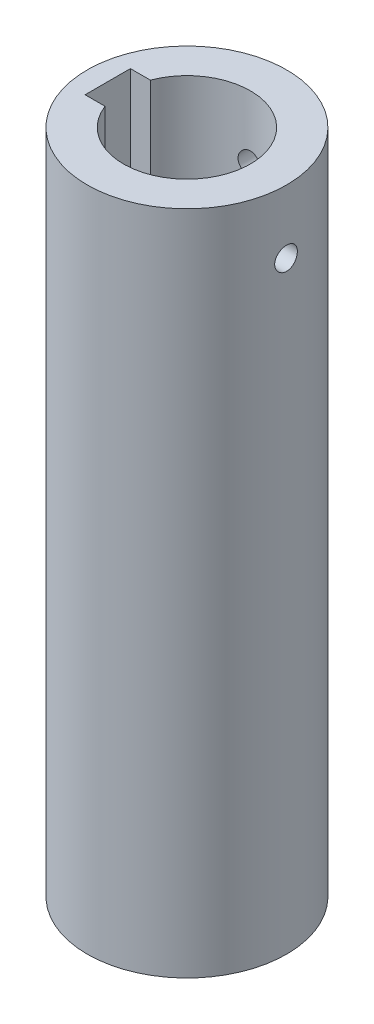
ISO-10303-21;
HEADER;
FILE_DESCRIPTION(('STEP AP214'),'2;1');
FILE_NAME('part.step','',(''),(''),'','','');
FILE_SCHEMA(('AUTOMOTIVE_DESIGN { 1 0 10303 214 1 1 1 1 }'));
ENDSEC;
DATA;
#1=APPLICATION_CONTEXT('core data for automotive mechanical design processes');
#2=APPLICATION_PROTOCOL_DEFINITION('international standard','automotive_design',2000,#1);
#3=PRODUCT_CONTEXT('',#1,'mechanical');
#4=PRODUCT('Part','Part','',(#3));
#5=PRODUCT_RELATED_PRODUCT_CATEGORY('part','',(#4));
#6=PRODUCT_DEFINITION_FORMATION('','',#4);
#7=PRODUCT_DEFINITION_CONTEXT('part definition',#1,'design');
#8=PRODUCT_DEFINITION('design','',#6,#7);
#9=PRODUCT_DEFINITION_SHAPE('','',#8);
#10=(LENGTH_UNIT() NAMED_UNIT(*) SI_UNIT(.MILLI.,.METRE.));
#11=(NAMED_UNIT(*) PLANE_ANGLE_UNIT() SI_UNIT($,.RADIAN.));
#12=(NAMED_UNIT(*) SI_UNIT($,.STERADIAN.) SOLID_ANGLE_UNIT());
#13=UNCERTAINTY_MEASURE_WITH_UNIT(LENGTH_MEASURE(1.E-05),#10,'distance_accuracy_value','');
#14=(GEOMETRIC_REPRESENTATION_CONTEXT(3) GLOBAL_UNCERTAINTY_ASSIGNED_CONTEXT((#13)) GLOBAL_UNIT_ASSIGNED_CONTEXT((#10,
#11,#12)) REPRESENTATION_CONTEXT('',''));
#15=CARTESIAN_POINT('',(0.,0.,0.));
#16=DIRECTION('',(0.,0.,1.));
#17=DIRECTION('',(1.,0.,0.));
#18=AXIS2_PLACEMENT_3D('',#15,#16,#17);
#19=CARTESIAN_POINT('',(0.,36.75,0.));
#20=DIRECTION('',(0.,1.,0.));
#21=DIRECTION('',(0.,0.,1.));
#22=AXIS2_PLACEMENT_3D('',#19,#20,#21);
#23=PLANE('',#22);
#24=CARTESIAN_POINT('',(0.,36.75,0.));
#25=DIRECTION('',(0.,1.,0.));
#26=DIRECTION('',(0.,0.,1.));
#27=AXIS2_PLACEMENT_3D('',#24,#25,#26);
#28=CIRCLE('',#27,11.);
#29=CARTESIAN_POINT('',(0.,36.75,11.));
#30=VERTEX_POINT('',#29);
#31=EDGE_CURVE('E100',#30,#30,#28,.T.);
#32=ORIENTED_EDGE('',*,*,#31,.T.);
#33=EDGE_LOOP('',(#32));
#34=FACE_BOUND('',#33,.T.);
#35=DIRECTION('',(0.,0.,-1.));
#36=VECTOR('',#35,1.);
#37=CARTESIAN_POINT('',(-8.73834841531101,36.75,0.));
#38=LINE('',#37,#36);
#39=CARTESIAN_POINT('',(-8.73834841531101,36.75,2.5));
#40=VERTEX_POINT('',#39);
#41=CARTESIAN_POINT('',(-8.73834841531101,36.75,-2.5));
#42=VERTEX_POINT('',#41);
#43=EDGE_CURVE('E59',#40,#42,#38,.T.);
#44=ORIENTED_EDGE('',*,*,#43,.T.);
#45=DIRECTION('',(1.,0.,0.));
#46=VECTOR('',#45,1.);
#47=CARTESIAN_POINT('',(0.,36.75,-2.5));
#48=LINE('',#47,#46);
#49=CARTESIAN_POINT('',(-6.53834841531101,36.75,-2.5));
#50=VERTEX_POINT('',#49);
#51=EDGE_CURVE('E118',#42,#50,#48,.T.);
#52=ORIENTED_EDGE('',*,*,#51,.T.);
#53=CARTESIAN_POINT('',(0.,36.75,0.));
#54=DIRECTION('',(0.,1.,0.));
#55=DIRECTION('',(0.,0.,1.));
#56=AXIS2_PLACEMENT_3D('',#53,#54,#55);
#57=CIRCLE('',#56,7.);
#58=CARTESIAN_POINT('',(-6.53834841531101,36.75,2.5));
#59=VERTEX_POINT('',#58);
#60=EDGE_CURVE('E178',#59,#50,#57,.T.);
#61=ORIENTED_EDGE('',*,*,#60,.F.);
#62=DIRECTION('',(-1.,0.,0.));
#63=VECTOR('',#62,1.);
#64=CARTESIAN_POINT('',(0.,36.75,2.5));
#65=LINE('',#64,#63);
#66=EDGE_CURVE('E64',#59,#40,#65,.T.);
#67=ORIENTED_EDGE('',*,*,#66,.T.);
#68=EDGE_LOOP('',(#44,#52,#61,#67));
#69=FACE_BOUND('',#68,.T.);
#70=ADVANCED_FACE('F42',(#34,#69),#23,.T.);
#71=CARTESIAN_POINT('',(0.,-36.75,0.));
#72=DIRECTION('',(0.,1.,0.));
#73=DIRECTION('',(0.,0.,1.));
#74=AXIS2_PLACEMENT_3D('',#71,#72,#73);
#75=PLANE('',#74);
#76=CARTESIAN_POINT('',(0.,-36.75,0.));
#77=DIRECTION('',(0.,1.,0.));
#78=DIRECTION('',(0.,0.,1.));
#79=AXIS2_PLACEMENT_3D('',#76,#77,#78);
#80=CIRCLE('',#79,11.);
#81=CARTESIAN_POINT('',(0.,-36.75,11.));
#82=VERTEX_POINT('',#81);
#83=EDGE_CURVE('E175',#82,#82,#80,.T.);
#84=ORIENTED_EDGE('',*,*,#83,.F.);
#85=EDGE_LOOP('',(#84));
#86=FACE_BOUND('',#85,.T.);
#87=DIRECTION('',(1.,0.,0.));
#88=VECTOR('',#87,1.);
#89=CARTESIAN_POINT('',(0.,-36.75,-2.5));
#90=LINE('',#89,#88);
#91=CARTESIAN_POINT('',(-8.73834841531101,-36.75,-2.5));
#92=VERTEX_POINT('',#91);
#93=CARTESIAN_POINT('',(-6.53834841531101,-36.75,-2.5));
#94=VERTEX_POINT('',#93);
#95=EDGE_CURVE('E11',#92,#94,#90,.T.);
#96=ORIENTED_EDGE('',*,*,#95,.F.);
#97=DIRECTION('',(0.,0.,-1.));
#98=VECTOR('',#97,1.);
#99=CARTESIAN_POINT('',(-8.73834841531101,-36.75,0.));
#100=LINE('',#99,#98);
#101=CARTESIAN_POINT('',(-8.73834841531101,-36.75,2.5));
#102=VERTEX_POINT('',#101);
#103=EDGE_CURVE('E52',#102,#92,#100,.T.);
#104=ORIENTED_EDGE('',*,*,#103,.F.);
#105=DIRECTION('',(-1.,0.,0.));
#106=VECTOR('',#105,1.);
#107=CARTESIAN_POINT('',(0.,-36.75,2.5));
#108=LINE('',#107,#106);
#109=CARTESIAN_POINT('',(-6.53834841531101,-36.75,2.5));
#110=VERTEX_POINT('',#109);
#111=EDGE_CURVE('E86',#110,#102,#108,.T.);
#112=ORIENTED_EDGE('',*,*,#111,.F.);
#113=CARTESIAN_POINT('',(0.,-36.75,0.));
#114=DIRECTION('',(0.,1.,0.));
#115=DIRECTION('',(0.,0.,1.));
#116=AXIS2_PLACEMENT_3D('',#113,#114,#115);
#117=CIRCLE('',#116,7.);
#118=EDGE_CURVE('E184',#110,#94,#117,.T.);
#119=ORIENTED_EDGE('',*,*,#118,.T.);
#120=EDGE_LOOP('',(#96,#104,#112,#119));
#121=FACE_BOUND('',#120,.T.);
#122=ADVANCED_FACE('F84',(#86,#121),#75,.F.);
#123=CARTESIAN_POINT('',(0.,36.75,0.));
#124=DIRECTION('',(0.,-1.,0.));
#125=DIRECTION('',(0.,0.,-1.));
#126=AXIS2_PLACEMENT_3D('',#123,#124,#125);
#127=CYLINDRICAL_SURFACE('',#126,11.);
#128=CARTESIAN_POINT('',(10.9287464971972,29.75,-1.24999999999996));
#129=CARTESIAN_POINT('',(10.9287474203412,29.6800305842613,-1.24999699672958));
#130=CARTESIAN_POINT('',(10.9294256968444,29.6100162149609,-1.24410533123416));
#131=CARTESIAN_POINT('',(10.93206480453,29.4719324468276,-1.22069346279131));
#132=CARTESIAN_POINT('',(10.9340270111777,29.4038652156636,-1.20316078861798));
#133=CARTESIAN_POINT('',(10.9390089167987,29.2716951523593,-1.15698736299401));
#134=CARTESIAN_POINT('',(10.9420279348789,29.2075897988341,-1.12835376248756));
#135=CARTESIAN_POINT('',(10.9487824680852,29.0851073826262,-1.06080587174065));
#136=CARTESIAN_POINT('',(10.9525178511687,29.0267292672735,-1.02189347562245));
#137=CARTESIAN_POINT('',(10.960303690773,28.9170740793633,-0.934698474057933));
#138=CARTESIAN_POINT('',(10.9643553896711,28.8658274589927,-0.886377679317052));
#139=CARTESIAN_POINT('',(10.972306118699,28.772152635249,-0.781819512439376));
#140=CARTESIAN_POINT('',(10.9762051415251,28.7297248533291,-0.725581762165833));
#141=CARTESIAN_POINT('',(10.9834237379778,28.6547845265636,-0.606596705986008));
#142=CARTESIAN_POINT('',(10.9867417055687,28.6222992834268,-0.54383209892827));
#143=CARTESIAN_POINT('',(10.9924107489094,28.5683409317162,-0.41369460258411));
#144=CARTESIAN_POINT('',(10.9947618545927,28.5468674822175,-0.346321856038748));
#145=CARTESIAN_POINT('',(10.9982235300395,28.5156325459075,-0.209190502606224));
#146=CARTESIAN_POINT('',(10.9993394351575,28.5058206741394,-0.139443508922356));
#147=CARTESIAN_POINT('',(11.0002231636486,28.4980313857927,0.00071549691808678));
#148=CARTESIAN_POINT('',(10.9999910313565,28.5000535800112,0.0711274871279749));
#149=CARTESIAN_POINT('',(10.9982091802183,28.5158343925776,0.210275315304622));
#150=CARTESIAN_POINT('',(10.9966655443008,28.5295388281065,0.279017386981339));
#151=CARTESIAN_POINT('',(10.9924410331793,28.5682105448547,0.413219512424852));
#152=CARTESIAN_POINT('',(10.9897601395885,28.5931780081703,0.47867951310937));
#153=CARTESIAN_POINT('',(10.9835519389979,28.6537255252043,0.60462853971202));
#154=CARTESIAN_POINT('',(10.9800227450904,28.6893292811366,0.665106074475318));
#155=CARTESIAN_POINT('',(10.9725133526563,28.7701214985528,0.779248064757881));
#156=CARTESIAN_POINT('',(10.9685331370339,28.8153103234111,0.832912261857155));
#157=CARTESIAN_POINT('',(10.9605411888319,28.9142940143929,0.932222110575117));
#158=CARTESIAN_POINT('',(10.9565294052378,28.9681360607783,0.977820745734589));
#159=CARTESIAN_POINT('',(10.948948782293,29.0827350215473,1.05934036226847));
#160=CARTESIAN_POINT('',(10.9453799439327,29.1434919513897,1.0952613220068));
#161=CARTESIAN_POINT('',(10.9390891806396,29.2702351263802,1.15640720127773));
#162=CARTESIAN_POINT('',(10.9363675210467,29.3362230017786,1.18162877061343));
#163=CARTESIAN_POINT('',(10.932084617603,29.4715350374498,1.22062039793324));
#164=CARTESIAN_POINT('',(10.9305233278108,29.5408590655218,1.23439090929006));
#165=CARTESIAN_POINT('',(10.9287461489754,29.6804615086792,1.25002812351634));
#166=CARTESIAN_POINT('',(10.9285228030647,29.750732442199,1.25196080445258));
#167=CARTESIAN_POINT('',(10.9294271020208,29.8905971142031,1.2440411900363));
#168=CARTESIAN_POINT('',(10.9305547231954,29.9601908645416,1.23418910135509));
#169=CARTESIAN_POINT('',(10.934027109398,30.0965305482009,1.2030349966658));
#170=CARTESIAN_POINT('',(10.9363685162129,30.1632837918333,1.18176456634841));
#171=CARTESIAN_POINT('',(10.9420019373599,30.2922755719963,1.12840995134923));
#172=CARTESIAN_POINT('',(10.9452939795481,30.3545139761633,1.09632544978198));
#173=CARTESIAN_POINT('',(10.9524757008179,30.4730089378336,1.02208976125464));
#174=CARTESIAN_POINT('',(10.9563679349346,30.52923809463,0.979895088421256));
#175=CARTESIAN_POINT('',(10.9643033061882,30.6338396721912,0.886698692111609));
#176=CARTESIAN_POINT('',(10.9683464481578,30.6822118410854,0.835696686407736));
#177=CARTESIAN_POINT('',(10.9761507988363,30.7699560606722,0.726046118323454));
#178=CARTESIAN_POINT('',(10.9799105987227,30.8092849070949,0.667362868733079));
#179=CARTESIAN_POINT('',(10.9867038511446,30.8775279306487,0.544185567231737));
#180=CARTESIAN_POINT('',(10.9897373161048,30.9064422859364,0.479691614745757));
#181=CARTESIAN_POINT('',(10.9947298091327,30.9529633102439,0.34687069927022));
#182=CARTESIAN_POINT('',(10.9966912595789,30.9705954885819,0.278552765803426));
#183=CARTESIAN_POINT('',(10.9993287265974,30.9941347668116,0.139902450650718));
#184=CARTESIAN_POINT('',(11.0000047905855,31.0000422992079,0.0695701433691407));
#185=CARTESIAN_POINT('',(10.9999951843542,30.9999574810621,-0.0706893992393187));
#186=CARTESIAN_POINT('',(10.9993171620335,30.9940319637664,-0.14061668501517));
#187=CARTESIAN_POINT('',(10.9966907038408,30.9705901239769,-0.278475148129063));
#188=CARTESIAN_POINT('',(10.9947422678608,30.9530738004971,-0.346406325297318));
#189=CARTESIAN_POINT('',(10.9897930802668,30.906967401429,-0.478339408461302));
#190=CARTESIAN_POINT('',(10.9867925769826,30.8783799389049,-0.542342237518401));
#191=CARTESIAN_POINT('',(10.9800725685956,30.8109497123396,-0.664652243903966));
#192=CARTESIAN_POINT('',(10.9763530610229,30.7721069130698,-0.722959401666048));
#193=CARTESIAN_POINT('',(10.9685858505536,30.6850195088565,-0.832565047844842));
#194=CARTESIAN_POINT('',(10.964536478797,30.636725108806,-0.883823854811283));
#195=CARTESIAN_POINT('',(10.9565797023843,30.5322070724043,-0.977537306944997));
#196=CARTESIAN_POINT('',(10.9526723317775,30.4759815498839,-1.01998985186796));
#197=CARTESIAN_POINT('',(10.9454285752331,30.3569938254487,-1.09499873222293));
#198=CARTESIAN_POINT('',(10.9420940638439,30.2942112053767,-1.12752283906708));
#199=CARTESIAN_POINT('',(10.9363956617408,30.1640751114031,-1.18152184496676));
#200=CARTESIAN_POINT('',(10.934030697042,30.0967267919478,-1.20300897659652));
#201=CARTESIAN_POINT('',(10.9311241409527,29.9825113436276,-1.22907619814514));
#202=CARTESIAN_POINT('',(10.9302368560492,29.9363696162629,-1.23691161329245));
#203=CARTESIAN_POINT('',(10.9290477274451,29.8434919481048,-1.2473745024337));
#204=CARTESIAN_POINT('',(10.9287458803201,29.7967560107888,-1.25000200689027));
#205=CARTESIAN_POINT('',(10.9287464971972,29.75,-1.24999999999996));
#206=B_SPLINE_CURVE_WITH_KNOTS('',3,(#128,#129,#130,#131,#132,#133,#134,#135,#136,#137,#138,
#139,#140,#141,#142,#143,#144,#145,#146,#147,#148,#149,#150,#151,#152,#153,#154,#155,#156,#157,
#158,#159,#160,#161,#162,#163,#164,#165,#166,#167,#168,#169,#170,#171,#172,#173,#174,#175,#176,
#177,#178,#179,#180,#181,#182,#183,#184,#185,#186,#187,#188,#189,#190,#191,#192,#193,#194,#195,
#196,#197,#198,#199,#200,#201,#202,#203,#204,#205),.UNSPECIFIED.,.T.,.F.,(4,2,2,2,2,2,2,2,2,2,2,
2,2,2,2,2,2,2,2,2,2,2,2,2,2,2,2,2,2,2,2,2,2,2,2,2,2,2,4),(0.,0.209737471020221,
0.419700000972302,0.629527502350869,0.839316364765077,1.04997522707931,1.26064415448742,
1.47188648272737,1.68312227051642,1.89344203717234,2.10375488679387,2.31309756927458,
2.52244363644887,2.73225974107011,2.94208380133525,3.15309333304239,3.36410333649311,
3.57517936278921,3.78624703172037,3.99613723801841,4.20602376349345,4.41533266527082,
4.62464770097443,4.83487973574455,5.04511850857034,5.25634173818707,5.46756135432011,
5.67830169349605,5.88903425863096,6.09857996924773,6.30812569768831,6.51762199823876,
6.72711901844817,6.93775100821768,7.14843317493098,7.35979213527311,7.57091633262042,
7.71107106616896,7.85122497990817),.UNSPECIFIED.);
#207=CARTESIAN_POINT('',(10.9287464971972,29.75,-1.24999999999996));
#208=VERTEX_POINT('',#207);
#209=EDGE_CURVE('E122',#208,#208,#206,.T.);
#210=ORIENTED_EDGE('',*,*,#209,.T.);
#211=EDGE_LOOP('',(#210));
#212=FACE_BOUND('',#211,.T.);
#213=CARTESIAN_POINT('',(0.,31.,-11.));
#214=CARTESIAN_POINT('',(-0.0699710602463521,30.9999969981881,-10.999999098796));
#215=CARTESIAN_POINT('',(-0.139987069063114,30.9941050650964,-10.9993252987046));
#216=CARTESIAN_POINT('',(-0.27807424350527,30.9706920371657,-10.996702178266));
#217=CARTESIAN_POINT('',(-0.346143242753096,30.9531584768452,-10.9947514907003));
#218=CARTESIAN_POINT('',(-0.478317045301572,30.9069824591417,-10.9897945640633));
#219=CARTESIAN_POINT('',(-0.542424355017517,30.8783471106271,-10.9867890005829));
#220=CARTESIAN_POINT('',(-0.664910051163533,30.81079510299,-10.9800574647103));
#221=CARTESIAN_POINT('',(-0.723289492682511,30.7718803422579,-10.9763316253718));
#222=CARTESIAN_POINT('',(-0.83294319220177,30.6846829482534,-10.968557071608));
#223=CARTESIAN_POINT('',(-0.884187415913992,30.6363626543237,-10.9645070990459));
#224=CARTESIAN_POINT('',(-0.977857611459199,30.5318064965901,-10.9565510031881));
#225=CARTESIAN_POINT('',(-1.0202831544839,30.4755702480959,-10.9526448868951));
#226=CARTESIAN_POINT('',(-1.09522113283393,30.3565865167743,-10.9454062056308));
#227=CARTESIAN_POINT('',(-1.12770585724159,30.2938214744848,-10.9420752550327));
#228=CARTESIAN_POINT('',(-1.18166312999782,30.1636830324506,-10.9363802408844));
#229=CARTESIAN_POINT('',(-1.20313602534931,30.0963097779948,-10.9340161468672));
#230=CARTESIAN_POINT('',(-1.23436981435034,29.9591768328081,-10.9305342775891));
#231=CARTESIAN_POINT('',(-1.24418104088519,29.8894287443214,-10.9294111476981));
#232=CARTESIAN_POINT('',(-1.25196865940665,29.7492675921606,-10.928521890078));
#233=CARTESIAN_POINT('',(-1.24994544765987,29.6788545508306,-10.9287557169125));
#234=CARTESIAN_POINT('',(-1.23416301698983,29.5397111909642,-10.9305490559729));
#235=CARTESIAN_POINT('',(-1.22045900541516,29.4709745187575,-10.9321023319257));
#236=CARTESIAN_POINT('',(-1.18179000539199,29.3367829730962,-10.9363498240334));
#237=CARTESIAN_POINT('',(-1.15682482519952,29.2713281555429,-10.9390440596154));
#238=CARTESIAN_POINT('',(-1.09628205008229,29.1453854396147,-10.9452770263127));
#239=CARTESIAN_POINT('',(-1.0606802226634,29.0849092893337,-10.9488176820281));
#240=CARTESIAN_POINT('',(-0.979892129097652,28.970769251552,-10.9563429994385));
#241=CARTESIAN_POINT('',(-0.934705500466708,28.9171056218141,-10.9603276779232));
#242=CARTESIAN_POINT('',(-0.835723376133609,28.8177933189767,-10.9683198318057));
#243=CARTESIAN_POINT('',(-0.781880249551103,28.7721921049877,-10.9723273076041));
#244=CARTESIAN_POINT('',(-0.667278205581039,28.6906677987206,-10.9798921650149));
#245=CARTESIAN_POINT('',(-0.606519276591015,28.6547447226797,-10.9834495458722));
#246=CARTESIAN_POINT('',(-0.479775541657344,28.5935973174981,-10.9897150774974));
#247=CARTESIAN_POINT('',(-0.413789421907936,28.568375688256,-10.9924230139116));
#248=CARTESIAN_POINT('',(-0.27848120509686,28.5293834039622,-10.9966825017733));
#249=CARTESIAN_POINT('',(-0.209159237088377,28.5156123063025,-10.9982340979176));
#250=CARTESIAN_POINT('',(-0.0695577812372845,28.4999728784791,-11.0000003081264));
#251=CARTESIAN_POINT('',(0.000714287189982848,28.4980391171442,-11.0002222716223));
#252=CARTESIAN_POINT('',(0.140581487877392,28.5059569758169,-10.9993239851522));
#253=CARTESIAN_POINT('',(0.210176631981749,28.5158083892428,-10.9982037587135));
#254=CARTESIAN_POINT('',(0.346523396585518,28.546962628467,-10.994751592849));
#255=CARTESIAN_POINT('',(0.413282173840755,28.5682345261404,-10.9924229265985));
#256=CARTESIAN_POINT('',(0.542284372808938,28.621593927211,-10.9868148348929));
#257=CARTESIAN_POINT('',(0.604527665792278,28.6536817388065,-10.9835353823457));
#258=CARTESIAN_POINT('',(0.72302600604694,28.7279223259681,-10.9763735736619));
#259=CARTESIAN_POINT('',(0.779254179921579,28.7701177471506,-10.9724886880503));
#260=CARTESIAN_POINT('',(0.883853426159775,28.8633150586091,-10.9645592695384));
#261=CARTESIAN_POINT('',(0.932224242281437,28.9143172359766,-10.9605147314369));
#262=CARTESIAN_POINT('',(1.01996547066726,29.0239672235654,-10.9526994422005));
#263=CARTESIAN_POINT('',(1.05929271449872,29.0826496885006,-10.9489300605485));
#264=CARTESIAN_POINT('',(1.12753292733449,29.2058249868653,-10.942113624429));
#265=CARTESIAN_POINT('',(1.1564460738557,29.2703177212307,-10.9390665576492));
#266=CARTESIAN_POINT('',(1.20296631338929,29.4031393505866,-10.9340487479586));
#267=CARTESIAN_POINT('',(1.22059839191765,29.471459400916,-10.9320756279092));
#268=CARTESIAN_POINT('',(1.2441367534757,29.6101141860863,-10.9294220488897));
#269=CARTESIAN_POINT('',(1.25004348037983,29.68044884456,-10.9287415409866));
#270=CARTESIAN_POINT('',(1.24995628412517,29.8207070578658,-10.9287514804399));
#271=CARTESIAN_POINT('',(1.2440301726015,29.8906306651932,-10.9294341158956));
#272=CARTESIAN_POINT('',(1.22058843708507,30.0284816214166,-10.9320766991578));
#273=CARTESIAN_POINT('',(1.20307280564944,30.0964089690304,-10.9340366477846));
#274=CARTESIAN_POINT('',(1.15696926667395,30.2283342740526,-10.9390107260672));
#275=CARTESIAN_POINT('',(1.12838402190138,30.2923331721536,-10.9420246021864));
#276=CARTESIAN_POINT('',(1.06095945000961,30.4146362400535,-10.9487674156768));
#277=CARTESIAN_POINT('',(1.0221200832636,30.472940387844,-10.9524963558113));
#278=CARTESIAN_POINT('',(0.935036488100245,30.5825461290002,-10.9602747641055));
#279=CARTESIAN_POINT('',(0.886741677283602,30.6338074186029,-10.96432588332));
#280=CARTESIAN_POINT('',(0.782221793226737,30.7275256880907,-10.972277338952));
#281=CARTESIAN_POINT('',(0.725994839471985,30.7699805742825,-10.9761776393339));
#282=CARTESIAN_POINT('',(0.60700591544028,30.8449920137295,-10.9834013412845));
#283=CARTESIAN_POINT('',(0.544223785737748,30.8775167487512,-10.9867228740683));
#284=CARTESIAN_POINT('',(0.414088724760015,30.9315170643377,-10.9923953332668));
#285=CARTESIAN_POINT('',(0.346740944451992,30.9530048694451,-10.9947473329669));
#286=CARTESIAN_POINT('',(0.23252369968441,30.9790739614261,-10.9976371163841));
#287=CARTESIAN_POINT('',(0.18637950484338,30.9869102185048,-10.9985189706332));
#288=CARTESIAN_POINT('',(0.0934968952111788,30.9973742258962,-10.9997007118951));
#289=CARTESIAN_POINT('',(0.0467584838174206,31.0000020059746,-11.0000006022337));
#290=CARTESIAN_POINT('',(0.,31.,-11.));
#291=B_SPLINE_CURVE_WITH_KNOTS('',3,(#213,#214,#215,#216,#217,#218,#219,#220,#221,#222,#223,
#224,#225,#226,#227,#228,#229,#230,#231,#232,#233,#234,#235,#236,#237,#238,#239,#240,#241,#242,
#243,#244,#245,#246,#247,#248,#249,#250,#251,#252,#253,#254,#255,#256,#257,#258,#259,#260,#261,
#262,#263,#264,#265,#266,#267,#268,#269,#270,#271,#272,#273,#274,#275,#276,#277,#278,#279,#280,
#281,#282,#283,#284,#285,#286,#287,#288,#289,#290),.UNSPECIFIED.,.T.,.F.,(4,2,2,2,2,2,2,2,2,2,2,
2,2,2,2,2,2,2,2,2,2,2,2,2,2,2,2,2,2,2,2,2,2,2,2,2,2,2,4),(0.,0.209742411074567,
0.419709770574088,0.629542902006036,0.839337308750922,1.04998970573655,1.26065234329855,
1.47189698188367,1.68313496335365,1.89345787180113,2.10377373779623,2.31310105799441,
2.52243194254448,2.73224341085968,2.94206281537296,3.15307892807649,3.36409539480162,
3.57516506786321,3.78622658187585,3.99612038686368,4.20601051268755,4.41533507552064,
4.62466560353622,4.83489538837652,5.04513202779439,5.25635228791534,5.46756894744211,
5.67831616606275,5.88905540649308,6.09859040856626,6.30812554520447,6.51761030997687,
6.72709588430993,6.93773434219371,7.14842282141904,7.35977947100789,7.57090151365799,
7.71106364850653,7.85122498234266),.UNSPECIFIED.);
#292=CARTESIAN_POINT('',(0.,31.,-11.));
#293=VERTEX_POINT('',#292);
#294=EDGE_CURVE('E131',#293,#293,#291,.T.);
#295=ORIENTED_EDGE('',*,*,#294,.T.);
#296=EDGE_LOOP('',(#295));
#297=FACE_BOUND('',#296,.T.);
#298=ORIENTED_EDGE('',*,*,#31,.F.);
#299=EDGE_LOOP('',(#298));
#300=FACE_BOUND('',#299,.T.);
#301=ORIENTED_EDGE('',*,*,#83,.T.);
#302=EDGE_LOOP('',(#301));
#303=FACE_BOUND('',#302,.T.);
#304=ADVANCED_FACE('F44',(#212,#297,#300,#303),#127,.T.);
#305=CARTESIAN_POINT('',(0.,36.75,0.));
#306=DIRECTION('',(0.,-1.,0.));
#307=DIRECTION('',(0.,0.,-1.));
#308=AXIS2_PLACEMENT_3D('',#305,#306,#307);
#309=CYLINDRICAL_SURFACE('',#308,7.);
#310=DIRECTION('',(0.,-1.,0.));
#311=VECTOR('',#310,1.);
#312=CARTESIAN_POINT('',(-6.53834841531101,136.51730739576,2.5));
#313=LINE('',#312,#311);
#314=EDGE_CURVE('E98',#59,#110,#313,.T.);
#315=ORIENTED_EDGE('',*,*,#314,.F.);
#316=ORIENTED_EDGE('',*,*,#60,.T.);
#317=DIRECTION('',(0.,-1.,0.));
#318=VECTOR('',#317,1.);
#319=CARTESIAN_POINT('',(-6.53834841531101,136.51730739576,-2.5));
#320=LINE('',#319,#318);
#321=EDGE_CURVE('E108',#50,#94,#320,.T.);
#322=ORIENTED_EDGE('',*,*,#321,.T.);
#323=ORIENTED_EDGE('',*,*,#118,.F.);
#324=EDGE_LOOP('',(#315,#316,#322,#323));
#325=FACE_BOUND('',#324,.T.);
#326=CARTESIAN_POINT('',(6.88748865697796,29.75,-1.24999999999998));
#327=CARTESIAN_POINT('',(6.88748996954044,29.6803901835029,-1.24999727058214));
#328=CARTESIAN_POINT('',(6.88855539631359,29.6107442290916,-1.24416565577499));
#329=CARTESIAN_POINT('',(6.89269731089964,29.4734118673178,-1.22100652068062));
#330=CARTESIAN_POINT('',(6.89577557035795,29.4057272411266,-1.20366887286764));
#331=CARTESIAN_POINT('',(6.90358364916876,29.2743246696732,-1.15804345864263));
#332=CARTESIAN_POINT('',(6.90831199983703,29.2106032561327,-1.12976542743177));
#333=CARTESIAN_POINT('',(6.91888575789873,29.0888144560962,-1.06308709156947));
#334=CARTESIAN_POINT('',(6.92473106114478,29.0307465432155,-1.02468773052898));
#335=CARTESIAN_POINT('',(6.93695388500191,28.9212515361101,-0.938394167704471));
#336=CARTESIAN_POINT('',(6.94333619287745,28.8698975914672,-0.890407813560967));
#337=CARTESIAN_POINT('',(6.95587151277918,28.7759247355374,-0.786501592761228));
#338=CARTESIAN_POINT('',(6.9620245103933,28.7333063725243,-0.730581228513101));
#339=CARTESIAN_POINT('',(6.97345895530131,28.6577366448664,-0.611916692615852));
#340=CARTESIAN_POINT('',(6.97873410967655,28.6248538644313,-0.549128185915821));
#341=CARTESIAN_POINT('',(6.98776505059445,28.5701301286572,-0.418808386401007));
#342=CARTESIAN_POINT('',(6.99152095044113,28.5482883498646,-0.35127744771157));
#343=CARTESIAN_POINT('',(6.99705638797053,28.5164917549774,-0.214146836822058));
#344=CARTESIAN_POINT('',(6.99885638662347,28.5064137914782,-0.144576558422021));
#345=CARTESIAN_POINT('',(7.00034763590468,28.4980475363768,-0.00471086886381403));
#346=CARTESIAN_POINT('',(7.00003905008465,28.4997583303833,0.065584485631752));
#347=CARTESIAN_POINT('',(6.99736398085761,28.5148258770984,0.204061494216453));
#348=CARTESIAN_POINT('',(6.99502092367385,28.5280500617993,0.272258090526054));
#349=CARTESIAN_POINT('',(6.98856637600324,28.5655597439554,0.405448507551194));
#350=CARTESIAN_POINT('',(6.98445482560808,28.5898456161306,0.470442219684828));
#351=CARTESIAN_POINT('',(6.97488577604636,28.6489179929582,0.595770759145084));
#352=CARTESIAN_POINT('',(6.96942141877376,28.6837582110411,0.656079724180693));
#353=CARTESIAN_POINT('',(6.95775231003517,28.7629108194694,0.77004507046766));
#354=CARTESIAN_POINT('',(6.95154749006553,28.8072240865113,0.823700835262663));
#355=CARTESIAN_POINT('',(6.93898404447278,28.9047975559941,0.923621204631578));
#356=CARTESIAN_POINT('',(6.93262448011293,28.9581736939189,0.969772549957023));
#357=CARTESIAN_POINT('',(6.92055128314469,29.0719696040865,1.05248393120502));
#358=CARTESIAN_POINT('',(6.9148376583352,29.1323894613554,1.08904385133035));
#359=CARTESIAN_POINT('',(6.90470226333919,29.2586995239486,1.15156239914804));
#360=CARTESIAN_POINT('',(6.90028234868336,29.3245974141231,1.17750582091648));
#361=CARTESIAN_POINT('',(6.89326416740436,29.4599129062057,1.21792201530051));
#362=CARTESIAN_POINT('',(6.89066571493895,29.5293301482621,1.23239595815695));
#363=CARTESIAN_POINT('',(6.88762108850772,29.6686960477206,1.24929958102736));
#364=CARTESIAN_POINT('',(6.88714593969675,29.738624423475,1.25189141836659));
#365=CARTESIAN_POINT('',(6.88832434230049,29.8779151685079,1.24539080908282));
#366=CARTESIAN_POINT('',(6.88997779872029,29.947277562906,1.23629888388006));
#367=CARTESIAN_POINT('',(6.89520021618655,30.0829422911342,1.20682762932923));
#368=CARTESIAN_POINT('',(6.89875493086167,30.1492634513035,1.18653221333191));
#369=CARTESIAN_POINT('',(6.90736720724906,30.277563656102,1.13531866755854));
#370=CARTESIAN_POINT('',(6.91242487063201,30.3395424066276,1.10439981911193));
#371=CARTESIAN_POINT('',(6.92353975122151,30.4581160632338,1.03243967511495));
#372=CARTESIAN_POINT('',(6.92960692638078,30.5146474542347,0.991295287980548));
#373=CARTESIAN_POINT('',(6.94202871683633,30.6200621275829,0.900192111722146));
#374=CARTESIAN_POINT('',(6.948383355442,30.6689447882836,0.850232606855287));
#375=CARTESIAN_POINT('',(6.96075653395235,30.7582741573581,0.742195671696063));
#376=CARTESIAN_POINT('',(6.96677010600177,30.7986122098076,0.68402774310817));
#377=CARTESIAN_POINT('',(6.97770176369223,30.868943031211,0.561646482834244));
#378=CARTESIAN_POINT('',(6.98261988865371,30.8989361715108,0.497433368254362));
#379=CARTESIAN_POINT('',(6.99078504784243,30.9475602592787,0.365094674162103));
#380=CARTESIAN_POINT('',(6.99404014454907,30.9662461082892,0.296989785710946));
#381=CARTESIAN_POINT('',(6.99854674650377,30.99190114174,0.158545171643482));
#382=CARTESIAN_POINT('',(6.9997984421407,30.9988714395453,0.0882056590378142));
#383=CARTESIAN_POINT('',(7.00015390840352,31.0008617134734,-0.0516665846856724));
#384=CARTESIAN_POINT('',(6.99928727056153,30.996046325568,-0.121196952146417));
#385=CARTESIAN_POINT('',(6.99556445478262,30.9749605166306,-0.258441278027678));
#386=CARTESIAN_POINT('',(6.99270829223196,30.958690184187,-0.326155250491328));
#387=CARTESIAN_POINT('',(6.98532676084549,30.9152230315144,-0.457768248748333));
#388=CARTESIAN_POINT('',(6.98080383338057,30.8880421871359,-0.521672696232881));
#389=CARTESIAN_POINT('',(6.97058019672508,30.823544653445,-0.644038951932181));
#390=CARTESIAN_POINT('',(6.96487941863182,30.7862273711241,-0.702500441450721));
#391=CARTESIAN_POINT('',(6.952836532558,30.7019420056428,-0.81314573886997));
#392=CARTESIAN_POINT('',(6.9464870207338,30.6548542405833,-0.865237582180791));
#393=CARTESIAN_POINT('',(6.9339109875311,30.5526143140211,-0.960837754478928));
#394=CARTESIAN_POINT('',(6.92768449534789,30.4974602636967,-1.00434406743568));
#395=CARTESIAN_POINT('',(6.91600352705983,30.3801094193979,-1.08187311208399));
#396=CARTESIAN_POINT('',(6.91055585858271,30.3178581736493,-1.11581447160547));
#397=CARTESIAN_POINT('',(6.90113054241701,30.1884624661308,-1.1727044347009));
#398=CARTESIAN_POINT('',(6.89715147194969,30.1213228161701,-1.19566368416919));
#399=CARTESIAN_POINT('',(6.89196709058453,30.0032966323995,-1.22512899390275));
#400=CARTESIAN_POINT('',(6.89029736637019,29.9531120670467,-1.23444009540766));
#401=CARTESIAN_POINT('',(6.88805768145138,29.8519581190136,-1.24687652719075));
#402=CARTESIAN_POINT('',(6.88748769553417,29.8009887543528,-1.25000199928144));
#403=CARTESIAN_POINT('',(6.88748865697796,29.75,-1.24999999999998));
#404=B_SPLINE_CURVE_WITH_KNOTS('',3,(#326,#327,#328,#329,#330,#331,#332,#333,#334,#335,#336,
#337,#338,#339,#340,#341,#342,#343,#344,#345,#346,#347,#348,#349,#350,#351,#352,#353,#354,#355,
#356,#357,#358,#359,#360,#361,#362,#363,#364,#365,#366,#367,#368,#369,#370,#371,#372,#373,#374,
#375,#376,#377,#378,#379,#380,#381,#382,#383,#384,#385,#386,#387,#388,#389,#390,#391,#392,#393,
#394,#395,#396,#397,#398,#399,#400,#401,#402,#403),.UNSPECIFIED.,.T.,.F.,(4,2,2,2,2,2,2,2,2,2,2,
2,2,2,2,2,2,2,2,2,2,2,2,2,2,2,2,2,2,2,2,2,2,2,2,2,2,2,4),(0.,0.208642917991771,0.41746972595052,
0.626111137078803,0.834733103457362,1.04546625757606,1.25621263394899,1.46841013637387,
1.68059181046932,1.89053179249466,2.10045549077496,2.307993573028,2.51553868625637,
2.72415831217086,2.93279725344393,3.14433992309173,3.35588514657533,3.56773231290167,
3.77955786149435,3.98848380898912,4.19740043290864,4.40477310984191,4.61215981820875,
4.82172878741966,5.03131478040494,5.24342420945207,5.45552602372823,5.66658955603054,
5.87763302917865,6.08574527367399,6.29385590872266,6.50166292039702,6.70948209195076,
6.9200155593783,7.1305984050219,7.34292209858121,7.55503954947581,7.70787268329134,
7.86070231319515),.UNSPECIFIED.);
#405=CARTESIAN_POINT('',(6.88748865697796,29.75,-1.24999999999998));
#406=VERTEX_POINT('',#405);
#407=EDGE_CURVE('E121',#406,#406,#404,.T.);
#408=ORIENTED_EDGE('',*,*,#407,.F.);
#409=EDGE_LOOP('',(#408));
#410=FACE_BOUND('',#409,.T.);
#411=CARTESIAN_POINT('',(0.,31.,-7.));
#412=CARTESIAN_POINT('',(-0.069619792442346,30.9999972786989,-6.99999876397597));
#413=CARTESIAN_POINT('',(-0.139275699399383,30.9941640487748,-6.99895060928587));
#414=CARTESIAN_POINT('',(-0.276628730775725,30.9709979168089,-6.99487029587919));
#415=CARTESIAN_POINT('',(-0.344324082054933,30.9536549245811,-6.99183639636521));
#416=CARTESIAN_POINT('',(-0.475749358001672,30.908013883381,-6.98412437753366));
#417=CARTESIAN_POINT('',(-0.53948266011731,30.8797253178158,-6.97944768188137));
#418=CARTESIAN_POINT('',(-0.661291471994224,30.8130221558915,-6.96896231649392));
#419=CARTESIAN_POINT('',(-0.719367522091878,30.7746085279003,-6.96315375502504));
#420=CARTESIAN_POINT('',(-0.828853721624179,30.6883003934912,-6.95097616233974));
#421=CARTESIAN_POINT('',(-0.880193210153493,30.6403169350645,-6.94460221026335));
#422=CARTESIAN_POINT('',(-0.974138056636684,30.5364226252312,-6.93204924305886));
#423=CARTESIAN_POINT('',(-1.01674282190199,30.4805112363156,-6.92587024118302));
#424=CARTESIAN_POINT('',(-1.09229802264274,30.3618549414433,-6.91435905121301));
#425=CARTESIAN_POINT('',(-1.1251774596852,30.299064156538,-6.90903321476433));
#426=CARTESIAN_POINT('',(-1.17989439084462,30.1687394206677,-6.89990026216799));
#427=CARTESIAN_POINT('',(-1.20173274507262,30.1012058396381,-6.89609302772464));
#428=CARTESIAN_POINT('',(-1.23352263528584,29.9640655892926,-6.89047765557561));
#429=CARTESIAN_POINT('',(-1.24359686781956,29.8944882224292,-6.88864889795947));
#430=CARTESIAN_POINT('',(-1.25195320297837,29.7546085389963,-6.88713528511934));
#431=CARTESIAN_POINT('',(-1.25023626389775,29.6843062818039,-6.88745025566986));
#432=CARTESIAN_POINT('',(-1.23515868236774,29.5458555512817,-6.89016971388499));
#433=CARTESIAN_POINT('',(-1.22193680797517,29.4776914048729,-6.8925492980011));
#434=CARTESIAN_POINT('',(-1.18444287693055,29.3445646817507,-6.89909080824472));
#435=CARTESIAN_POINT('',(-1.16017039053015,29.2796022296573,-6.90325280368823));
#436=CARTESIAN_POINT('',(-1.1011263389819,29.1543127605654,-6.9129166031172));
#437=CARTESIAN_POINT('',(-1.06629803938021,29.0940130591956,-6.91842561521352));
#438=CARTESIAN_POINT('',(-0.987171201031504,28.9800612488923,-6.93015785316704));
#439=CARTESIAN_POINT('',(-0.942871787902347,28.9264097544504,-6.93638114494264));
#440=CARTESIAN_POINT('',(-0.845308544532938,28.8264748911063,-6.94894965501386));
#441=CARTESIAN_POINT('',(-0.79192585575831,28.7803075410102,-6.95529534624387));
#442=CARTESIAN_POINT('',(-0.678111000701384,28.697566933546,-6.96731186800251));
#443=CARTESIAN_POINT('',(-0.617678775645582,28.6609937561748,-6.97298269290384));
#444=CARTESIAN_POINT('',(-0.491364562705147,28.5984654881519,-6.98302041929516));
#445=CARTESIAN_POINT('',(-0.425476883346252,28.572521658851,-6.98738593655032));
#446=CARTESIAN_POINT('',(-0.29018370051797,28.532101558904,-6.99431030998523));
#447=CARTESIAN_POINT('',(-0.22077853618241,28.5176241849636,-6.99686933998133));
#448=CARTESIAN_POINT('',(-0.0814194926908562,28.5007075769775,-6.9998687531765));
#449=CARTESIAN_POINT('',(-0.0114855085287163,28.498109245726,-7.00033713461244));
#450=CARTESIAN_POINT('',(0.127817981130509,28.5045988698817,-6.99917952689596));
#451=CARTESIAN_POINT('',(0.19718751154823,28.5136863065139,-6.99755363071634));
#452=CARTESIAN_POINT('',(0.33289415494002,28.5431571992451,-6.99240754172808));
#453=CARTESIAN_POINT('',(0.399249135096588,28.5634609196089,-6.98890072530254));
#454=CARTESIAN_POINT('',(0.527613333347352,28.6147023150927,-6.98038436613849));
#455=CARTESIAN_POINT('',(0.589622278004154,28.6456406585844,-6.97537472895227));
#456=CARTESIAN_POINT('',(0.708218549757099,28.7176306114562,-6.96433866934137));
#457=CARTESIAN_POINT('',(0.764745364265279,28.7587803957699,-6.95830256688857));
#458=CARTESIAN_POINT('',(0.870148314945131,28.8498913255308,-6.94590984015708));
#459=CARTESIAN_POINT('',(0.9190238067952,28.8998532122967,-6.93955318894436));
#460=CARTESIAN_POINT('',(1.00833474628658,29.0078874846238,-6.92714394562996));
#461=CARTESIAN_POINT('',(1.04866208560834,29.0660498504336,-6.92109590760897));
#462=CARTESIAN_POINT('',(1.118974135387,29.1884168447244,-6.91007733322136));
#463=CARTESIAN_POINT('',(1.14895920685207,29.2526212622014,-6.90510675924693));
#464=CARTESIAN_POINT('',(1.19757853098714,29.3849630874203,-6.89684095181923));
#465=CARTESIAN_POINT('',(1.21626421462318,29.4530811054091,-6.89353813880083));
#466=CARTESIAN_POINT('',(1.24191447945726,29.5915536475731,-6.88896372120458));
#467=CARTESIAN_POINT('',(1.24888024712932,29.6619079446224,-6.88769191101738));
#468=CARTESIAN_POINT('',(1.25085614890263,29.8017746044507,-6.88733324217078));
#469=CARTESIAN_POINT('',(1.24603664017667,29.8712845385709,-6.88821524963872));
#470=CARTESIAN_POINT('',(1.22494973121549,30.008486909009,-6.89199615523606));
#471=CARTESIAN_POINT('',(1.20868238480685,30.0761793538711,-6.89489504388228));
#472=CARTESIAN_POINT('',(1.16523056932675,30.2077449380167,-6.90237052940211));
#473=CARTESIAN_POINT('',(1.13806288257358,30.271623775893,-6.9069445462846));
#474=CARTESIAN_POINT('',(1.07359967028368,30.3939442197184,-6.91725701322019));
#475=CARTESIAN_POINT('',(1.03630352227253,30.4523854911892,-6.92299553483587));
#476=CARTESIAN_POINT('',(0.952042837143916,30.563028523695,-6.93508798882304));
#477=CARTESIAN_POINT('',(0.904953705777516,30.6151346158716,-6.94144922951402));
#478=CARTESIAN_POINT('',(0.80270499863016,30.7107629029831,-6.95401412176594));
#479=CARTESIAN_POINT('',(0.747543569019638,30.7542831207386,-6.9602177367425));
#480=CARTESIAN_POINT('',(0.630185373301317,30.8318288838944,-6.9718267339403));
#481=CARTESIAN_POINT('',(0.567935518835291,30.8657751296958,-6.97722528421424));
#482=CARTESIAN_POINT('',(0.43854242009524,30.9226746016464,-6.98654935562556));
#483=CARTESIAN_POINT('',(0.371403967978271,30.9456384307488,-6.99047629672906));
#484=CARTESIAN_POINT('',(0.253365877745874,30.975115306698,-6.99558898678742));
#485=CARTESIAN_POINT('',(0.203167433835835,30.9844315684684,-6.99723399859316));
#486=CARTESIAN_POINT('',(0.10198577601947,30.9968748452019,-6.99943994626216));
#487=CARTESIAN_POINT('',(0.0510025790548309,31.0000019935907,-7.00000090549557));
#488=CARTESIAN_POINT('',(0.,31.,-7.));
#489=B_SPLINE_CURVE_WITH_KNOTS('',3,(#411,#412,#413,#414,#415,#416,#417,#418,#419,#420,#421,
#422,#423,#424,#425,#426,#427,#428,#429,#430,#431,#432,#433,#434,#435,#436,#437,#438,#439,#440,
#441,#442,#443,#444,#445,#446,#447,#448,#449,#450,#451,#452,#453,#454,#455,#456,#457,#458,#459,
#460,#461,#462,#463,#464,#465,#466,#467,#468,#469,#470,#471,#472,#473,#474,#475,#476,#477,#478,
#479,#480,#481,#482,#483,#484,#485,#486,#487,#488),.UNSPECIFIED.,.T.,.F.,(4,2,2,2,2,2,2,2,2,2,2,
2,2,2,2,2,2,2,2,2,2,2,2,2,2,2,2,2,2,2,2,2,2,2,2,2,2,2,4),(0.,0.208672898370815,
0.417528974687012,0.626204498745021,0.834860072169512,1.04555398394513,1.2562621874814,
1.46847268234669,1.68066664326101,1.89062713379413,2.10057056058129,2.30801629213301,
2.51547009175178,2.72405928697552,2.93266774767276,3.14425188945737,3.35583779539071,
3.56764729168084,3.77943640533442,3.98838053310807,4.19731538539161,4.40478370072622,
4.61226505754756,4.82182420244066,5.03140098492949,5.24348810388942,5.45556781896717,
5.66667480743362,5.87776042304789,6.08581286176576,6.29386432224868,6.50159668543025,
6.70934181830654,6.91991234386764,7.13053130374628,7.34284672270064,7.55495674626051,
7.70783116702345,7.8607022920641),.UNSPECIFIED.);
#490=CARTESIAN_POINT('',(0.,31.,-7.));
#491=VERTEX_POINT('',#490);
#492=EDGE_CURVE('E130',#491,#491,#489,.T.);
#493=ORIENTED_EDGE('',*,*,#492,.F.);
#494=EDGE_LOOP('',(#493));
#495=FACE_BOUND('',#494,.T.);
#496=ADVANCED_FACE('F159',(#325,#410,#495),#309,.F.);
#497=CARTESIAN_POINT('',(0.,29.75,-0.999999999999999));
#498=DIRECTION('',(0.,0.,-1.));
#499=DIRECTION('',(-1.,0.,0.));
#500=AXIS2_PLACEMENT_3D('',#497,#498,#499);
#501=CYLINDRICAL_SURFACE('',#500,1.25);
#502=ORIENTED_EDGE('',*,*,#492,.T.);
#503=EDGE_LOOP('',(#502));
#504=FACE_BOUND('',#503,.T.);
#505=ORIENTED_EDGE('',*,*,#294,.F.);
#506=EDGE_LOOP('',(#505));
#507=FACE_BOUND('',#506,.T.);
#508=ADVANCED_FACE('F142',(#504,#507),#501,.F.);
#509=CARTESIAN_POINT('',(0.999999999999999,29.75,0.));
#510=DIRECTION('',(1.,0.,0.));
#511=DIRECTION('',(0.,0.,-1.));
#512=AXIS2_PLACEMENT_3D('',#509,#510,#511);
#513=CYLINDRICAL_SURFACE('',#512,1.25);
#514=ORIENTED_EDGE('',*,*,#407,.T.);
#515=EDGE_LOOP('',(#514));
#516=FACE_BOUND('',#515,.T.);
#517=ORIENTED_EDGE('',*,*,#209,.F.);
#518=EDGE_LOOP('',(#517));
#519=FACE_BOUND('',#518,.T.);
#520=ADVANCED_FACE('F137',(#516,#519),#513,.F.);
#521=CARTESIAN_POINT('',(-6.53834841531101,136.51730739576,-2.5));
#522=DIRECTION('',(0.,0.,1.));
#523=DIRECTION('',(1.,0.,0.));
#524=AXIS2_PLACEMENT_3D('',#521,#522,#523);
#525=PLANE('',#524);
#526=ORIENTED_EDGE('',*,*,#51,.F.);
#527=DIRECTION('',(0.,-1.,0.));
#528=VECTOR('',#527,1.);
#529=CARTESIAN_POINT('',(-8.73834841531101,136.51730739576,-2.5));
#530=LINE('',#529,#528);
#531=EDGE_CURVE('E104',#42,#92,#530,.T.);
#532=ORIENTED_EDGE('',*,*,#531,.T.);
#533=ORIENTED_EDGE('',*,*,#95,.T.);
#534=ORIENTED_EDGE('',*,*,#321,.F.);
#535=EDGE_LOOP('',(#526,#532,#533,#534));
#536=FACE_BOUND('',#535,.T.);
#537=ADVANCED_FACE('F141',(#536),#525,.T.);
#538=CARTESIAN_POINT('',(-8.73834841531101,136.51730739576,-2.5));
#539=DIRECTION('',(1.,0.,0.));
#540=DIRECTION('',(0.,0.,-1.));
#541=AXIS2_PLACEMENT_3D('',#538,#539,#540);
#542=PLANE('',#541);
#543=ORIENTED_EDGE('',*,*,#43,.F.);
#544=DIRECTION('',(0.,-1.,0.));
#545=VECTOR('',#544,1.);
#546=CARTESIAN_POINT('',(-8.73834841531101,136.51730739576,2.5));
#547=LINE('',#546,#545);
#548=EDGE_CURVE('E97',#40,#102,#547,.T.);
#549=ORIENTED_EDGE('',*,*,#548,.T.);
#550=ORIENTED_EDGE('',*,*,#103,.T.);
#551=ORIENTED_EDGE('',*,*,#531,.F.);
#552=EDGE_LOOP('',(#543,#549,#550,#551));
#553=FACE_BOUND('',#552,.T.);
#554=ADVANCED_FACE('F102',(#553),#542,.T.);
#555=CARTESIAN_POINT('',(-6.53834841531101,136.51730739576,2.5));
#556=DIRECTION('',(0.,0.,-1.));
#557=DIRECTION('',(-1.,0.,0.));
#558=AXIS2_PLACEMENT_3D('',#555,#556,#557);
#559=PLANE('',#558);
#560=ORIENTED_EDGE('',*,*,#66,.F.);
#561=ORIENTED_EDGE('',*,*,#314,.T.);
#562=ORIENTED_EDGE('',*,*,#111,.T.);
#563=ORIENTED_EDGE('',*,*,#548,.F.);
#564=EDGE_LOOP('',(#560,#561,#562,#563));
#565=FACE_BOUND('',#564,.T.);
#566=ADVANCED_FACE('F96',(#565),#559,.T.);
#567=CLOSED_SHELL('',(#70,#122,#304,#496,#508,#520,#537,#554,#566));
#568=MANIFOLD_SOLID_BREP('B2',#567);
#569=ADVANCED_BREP_SHAPE_REPRESENTATION('',(#18,#568),#14);
#570=SHAPE_DEFINITION_REPRESENTATION(#9,#569);
ENDSEC;
END-ISO-10303-21;
